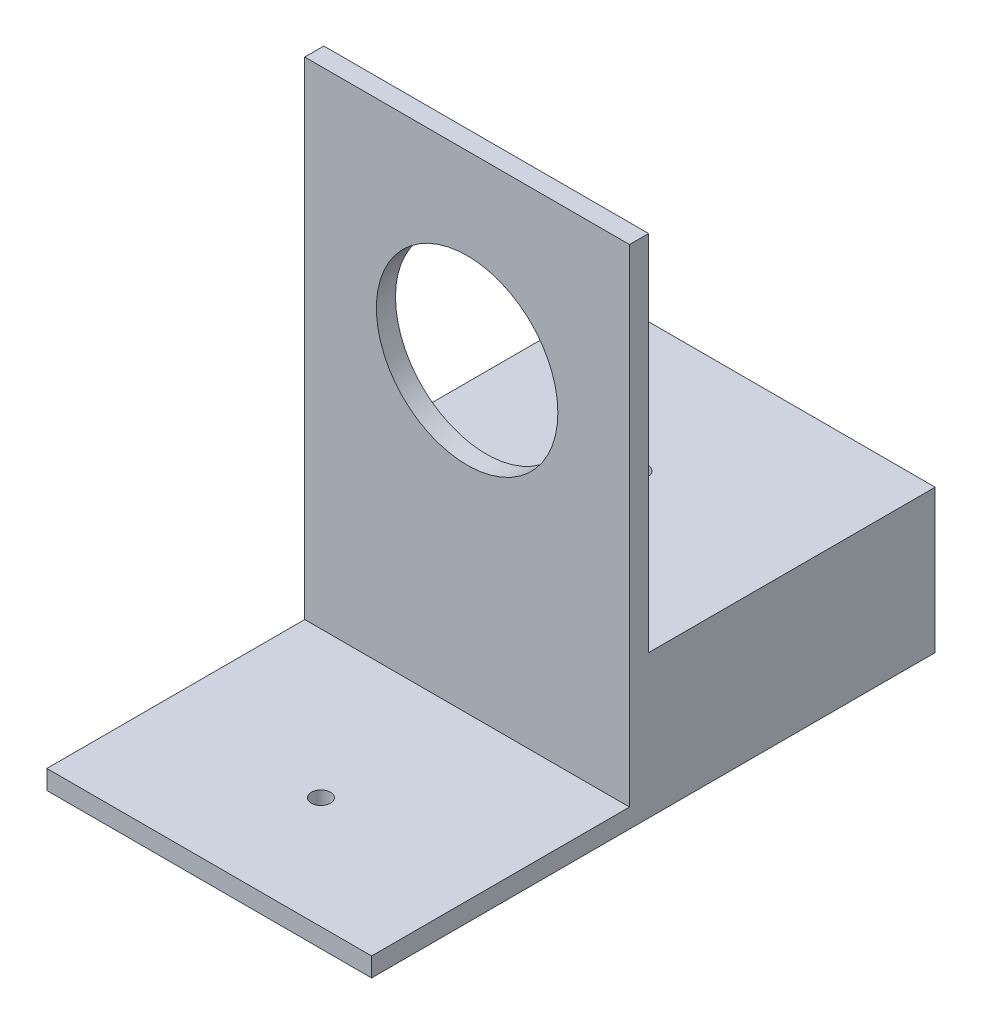
ISO-10303-21;
HEADER;
FILE_DESCRIPTION(('STEP AP214'),'2;1');
FILE_NAME('part.step','',(''),(''),'','','');
FILE_SCHEMA(('AUTOMOTIVE_DESIGN { 1 0 10303 214 1 1 1 1 }'));
ENDSEC;
DATA;
#1=APPLICATION_CONTEXT('core data for automotive mechanical design processes');
#2=APPLICATION_PROTOCOL_DEFINITION('international standard','automotive_design',2000,#1);
#3=PRODUCT_CONTEXT('',#1,'mechanical');
#4=PRODUCT('Part','Part','',(#3));
#5=PRODUCT_RELATED_PRODUCT_CATEGORY('part','',(#4));
#6=PRODUCT_DEFINITION_FORMATION('','',#4);
#7=PRODUCT_DEFINITION_CONTEXT('part definition',#1,'design');
#8=PRODUCT_DEFINITION('design','',#6,#7);
#9=PRODUCT_DEFINITION_SHAPE('','',#8);
#10=(LENGTH_UNIT() NAMED_UNIT(*) SI_UNIT(.MILLI.,.METRE.));
#11=(NAMED_UNIT(*) PLANE_ANGLE_UNIT() SI_UNIT($,.RADIAN.));
#12=(NAMED_UNIT(*) SI_UNIT($,.STERADIAN.) SOLID_ANGLE_UNIT());
#13=UNCERTAINTY_MEASURE_WITH_UNIT(LENGTH_MEASURE(1.E-05),#10,'distance_accuracy_value','');
#14=(GEOMETRIC_REPRESENTATION_CONTEXT(3) GLOBAL_UNCERTAINTY_ASSIGNED_CONTEXT((#13)) GLOBAL_UNIT_ASSIGNED_CONTEXT((#10,
#11,#12)) REPRESENTATION_CONTEXT('',''));
#15=CARTESIAN_POINT('',(0.,0.,0.));
#16=DIRECTION('',(0.,0.,1.));
#17=DIRECTION('',(1.,0.,0.));
#18=AXIS2_PLACEMENT_3D('',#15,#16,#17);
#19=CARTESIAN_POINT('',(0.,0.,2.));
#20=DIRECTION('',(0.,0.,-1.));
#21=DIRECTION('',(-1.,0.,0.));
#22=AXIS2_PLACEMENT_3D('',#19,#20,#21);
#23=PLANE('',#22);
#24=CARTESIAN_POINT('',(17.,34.,2.));
#25=DIRECTION('',(0.,0.,1.));
#26=DIRECTION('',(1.,0.,0.));
#27=AXIS2_PLACEMENT_3D('',#24,#25,#26);
#28=CIRCLE('',#27,9.5);
#29=CARTESIAN_POINT('',(26.5,34.,2.));
#30=VERTEX_POINT('',#29);
#31=EDGE_CURVE('E133',#30,#30,#28,.T.);
#32=ORIENTED_EDGE('',*,*,#31,.F.);
#33=EDGE_LOOP('',(#32));
#34=FACE_BOUND('',#33,.T.);
#35=DIRECTION('',(-1.,0.,0.));
#36=VECTOR('',#35,1.);
#37=CARTESIAN_POINT('',(0.,2.,2.));
#38=LINE('',#37,#36);
#39=CARTESIAN_POINT('',(34.,2.,2.));
#40=VERTEX_POINT('',#39);
#41=CARTESIAN_POINT('',(0.,2.,2.));
#42=VERTEX_POINT('',#41);
#43=EDGE_CURVE('E58',#40,#42,#38,.T.);
#44=ORIENTED_EDGE('',*,*,#43,.F.);
#45=DIRECTION('',(0.,1.,0.));
#46=VECTOR('',#45,1.);
#47=CARTESIAN_POINT('',(34.,0.,2.));
#48=LINE('',#47,#46);
#49=CARTESIAN_POINT('',(34.,53.,2.));
#50=VERTEX_POINT('',#49);
#51=EDGE_CURVE('E177',#40,#50,#48,.T.);
#52=ORIENTED_EDGE('',*,*,#51,.T.);
#53=DIRECTION('',(-1.,0.,0.));
#54=VECTOR('',#53,1.);
#55=CARTESIAN_POINT('',(0.,53.,2.));
#56=LINE('',#55,#54);
#57=CARTESIAN_POINT('',(0.,53.,2.));
#58=VERTEX_POINT('',#57);
#59=EDGE_CURVE('E171',#50,#58,#56,.T.);
#60=ORIENTED_EDGE('',*,*,#59,.T.);
#61=DIRECTION('',(0.,-1.,0.));
#62=VECTOR('',#61,1.);
#63=CARTESIAN_POINT('',(0.,0.,2.));
#64=LINE('',#63,#62);
#65=EDGE_CURVE('E167',#58,#42,#64,.T.);
#66=ORIENTED_EDGE('',*,*,#65,.T.);
#67=EDGE_LOOP('',(#44,#52,#60,#66));
#68=FACE_BOUND('',#67,.T.);
#69=ADVANCED_FACE('F33',(#34,#68),#23,.F.);
#70=CARTESIAN_POINT('',(0.,0.,2.));
#71=DIRECTION('',(1.,0.,0.));
#72=DIRECTION('',(0.,0.,-1.));
#73=AXIS2_PLACEMENT_3D('',#70,#71,#72);
#74=PLANE('',#73);
#75=DIRECTION('',(0.,-1.,0.));
#76=VECTOR('',#75,1.);
#77=CARTESIAN_POINT('',(0.,0.,0.));
#78=LINE('',#77,#76);
#79=CARTESIAN_POINT('',(0.,53.,0.));
#80=VERTEX_POINT('',#79);
#81=CARTESIAN_POINT('',(0.,15.,0.));
#82=VERTEX_POINT('',#81);
#83=EDGE_CURVE('E121',#80,#82,#78,.T.);
#84=ORIENTED_EDGE('',*,*,#83,.T.);
#85=DIRECTION('',(0.,0.,1.));
#86=VECTOR('',#85,1.);
#87=CARTESIAN_POINT('',(0.,15.,-30.));
#88=LINE('',#87,#86);
#89=CARTESIAN_POINT('',(0.,15.,-30.));
#90=VERTEX_POINT('',#89);
#91=EDGE_CURVE('E104',#90,#82,#88,.T.);
#92=ORIENTED_EDGE('',*,*,#91,.F.);
#93=DIRECTION('',(0.,1.,0.));
#94=VECTOR('',#93,1.);
#95=CARTESIAN_POINT('',(0.,0.,-30.));
#96=LINE('',#95,#94);
#97=CARTESIAN_POINT('',(0.,0.,-30.));
#98=VERTEX_POINT('',#97);
#99=EDGE_CURVE('E111',#98,#90,#96,.T.);
#100=ORIENTED_EDGE('',*,*,#99,.F.);
#101=DIRECTION('',(0.,0.,-1.));
#102=VECTOR('',#101,1.);
#103=CARTESIAN_POINT('',(0.,0.,2.));
#104=LINE('',#103,#102);
#105=CARTESIAN_POINT('',(0.,0.,29.));
#106=VERTEX_POINT('',#105);
#107=EDGE_CURVE('E11',#106,#98,#104,.T.);
#108=ORIENTED_EDGE('',*,*,#107,.F.);
#109=DIRECTION('',(0.,-1.,0.));
#110=VECTOR('',#109,1.);
#111=CARTESIAN_POINT('',(0.,0.,29.));
#112=LINE('',#111,#110);
#113=CARTESIAN_POINT('',(0.,2.,29.));
#114=VERTEX_POINT('',#113);
#115=EDGE_CURVE('E123',#114,#106,#112,.T.);
#116=ORIENTED_EDGE('',*,*,#115,.F.);
#117=DIRECTION('',(0.,0.,-1.));
#118=VECTOR('',#117,1.);
#119=CARTESIAN_POINT('',(0.,2.,29.));
#120=LINE('',#119,#118);
#121=EDGE_CURVE('E198',#114,#42,#120,.T.);
#122=ORIENTED_EDGE('',*,*,#121,.T.);
#123=ORIENTED_EDGE('',*,*,#65,.F.);
#124=DIRECTION('',(0.,0.,-1.));
#125=VECTOR('',#124,1.);
#126=CARTESIAN_POINT('',(0.,53.,2.));
#127=LINE('',#126,#125);
#128=EDGE_CURVE('E168',#58,#80,#127,.T.);
#129=ORIENTED_EDGE('',*,*,#128,.T.);
#130=EDGE_LOOP('',(#84,#92,#100,#108,#116,#122,#123,#129));
#131=FACE_BOUND('',#130,.T.);
#132=ADVANCED_FACE('F35',(#131),#74,.F.);
#133=CARTESIAN_POINT('',(0.,0.,2.));
#134=DIRECTION('',(0.,1.,0.));
#135=DIRECTION('',(0.,0.,1.));
#136=AXIS2_PLACEMENT_3D('',#133,#134,#135);
#137=PLANE('',#136);
#138=CARTESIAN_POINT('',(17.,0.,17.3047537644477));
#139=DIRECTION('',(0.,-1.,0.));
#140=DIRECTION('',(0.,0.,-1.));
#141=AXIS2_PLACEMENT_3D('',#138,#139,#140);
#142=CIRCLE('',#141,1.000000032);
#143=CARTESIAN_POINT('',(17.,0.,16.3047537324477));
#144=VERTEX_POINT('',#143);
#145=EDGE_CURVE('E146',#144,#144,#142,.T.);
#146=ORIENTED_EDGE('',*,*,#145,.F.);
#147=EDGE_LOOP('',(#146));
#148=FACE_BOUND('',#147,.T.);
#149=CARTESIAN_POINT('',(17.,0.,-15.9455875156916));
#150=DIRECTION('',(0.,-1.,0.));
#151=DIRECTION('',(0.,0.,-1.));
#152=AXIS2_PLACEMENT_3D('',#149,#150,#151);
#153=CIRCLE('',#152,1.000000032);
#154=CARTESIAN_POINT('',(17.,0.,-16.9455875476916));
#155=VERTEX_POINT('',#154);
#156=EDGE_CURVE('E136',#155,#155,#153,.T.);
#157=ORIENTED_EDGE('',*,*,#156,.F.);
#158=EDGE_LOOP('',(#157));
#159=FACE_BOUND('',#158,.T.);
#160=ORIENTED_EDGE('',*,*,#107,.T.);
#161=DIRECTION('',(-1.,0.,0.));
#162=VECTOR('',#161,1.);
#163=CARTESIAN_POINT('',(0.,0.,-30.));
#164=LINE('',#163,#162);
#165=CARTESIAN_POINT('',(34.,0.,-30.));
#166=VERTEX_POINT('',#165);
#167=EDGE_CURVE('E117',#166,#98,#164,.T.);
#168=ORIENTED_EDGE('',*,*,#167,.F.);
#169=DIRECTION('',(0.,0.,-1.));
#170=VECTOR('',#169,1.);
#171=CARTESIAN_POINT('',(34.,0.,2.));
#172=LINE('',#171,#170);
#173=CARTESIAN_POINT('',(34.,0.,29.));
#174=VERTEX_POINT('',#173);
#175=EDGE_CURVE('E42',#174,#166,#172,.T.);
#176=ORIENTED_EDGE('',*,*,#175,.F.);
#177=DIRECTION('',(1.,0.,0.));
#178=VECTOR('',#177,1.);
#179=CARTESIAN_POINT('',(0.,0.,29.));
#180=LINE('',#179,#178);
#181=EDGE_CURVE('E213',#106,#174,#180,.T.);
#182=ORIENTED_EDGE('',*,*,#181,.F.);
#183=EDGE_LOOP('',(#160,#168,#176,#182));
#184=FACE_BOUND('',#183,.T.);
#185=ADVANCED_FACE('F219',(#148,#159,#184),#137,.F.);
#186=CARTESIAN_POINT('',(34.,0.,2.));
#187=DIRECTION('',(-1.,0.,0.));
#188=DIRECTION('',(0.,0.,1.));
#189=AXIS2_PLACEMENT_3D('',#186,#187,#188);
#190=PLANE('',#189);
#191=ORIENTED_EDGE('',*,*,#175,.T.);
#192=DIRECTION('',(0.,-1.,0.));
#193=VECTOR('',#192,1.);
#194=CARTESIAN_POINT('',(34.,0.,-30.));
#195=LINE('',#194,#193);
#196=CARTESIAN_POINT('',(34.,15.,-30.));
#197=VERTEX_POINT('',#196);
#198=EDGE_CURVE('E110',#197,#166,#195,.T.);
#199=ORIENTED_EDGE('',*,*,#198,.F.);
#200=DIRECTION('',(0.,0.,1.));
#201=VECTOR('',#200,1.);
#202=CARTESIAN_POINT('',(34.,15.,-30.));
#203=LINE('',#202,#201);
#204=CARTESIAN_POINT('',(34.,15.,0.));
#205=VERTEX_POINT('',#204);
#206=EDGE_CURVE('E106',#197,#205,#203,.T.);
#207=ORIENTED_EDGE('',*,*,#206,.T.);
#208=DIRECTION('',(0.,1.,0.));
#209=VECTOR('',#208,1.);
#210=CARTESIAN_POINT('',(34.,0.,0.));
#211=LINE('',#210,#209);
#212=CARTESIAN_POINT('',(34.,53.,0.));
#213=VERTEX_POINT('',#212);
#214=EDGE_CURVE('E156',#205,#213,#211,.T.);
#215=ORIENTED_EDGE('',*,*,#214,.T.);
#216=DIRECTION('',(0.,0.,-1.));
#217=VECTOR('',#216,1.);
#218=CARTESIAN_POINT('',(34.,53.,2.));
#219=LINE('',#218,#217);
#220=EDGE_CURVE('E170',#50,#213,#219,.T.);
#221=ORIENTED_EDGE('',*,*,#220,.F.);
#222=ORIENTED_EDGE('',*,*,#51,.F.);
#223=DIRECTION('',(0.,0.,-1.));
#224=VECTOR('',#223,1.);
#225=CARTESIAN_POINT('',(34.,2.,29.));
#226=LINE('',#225,#224);
#227=CARTESIAN_POINT('',(34.,2.,29.));
#228=VERTEX_POINT('',#227);
#229=EDGE_CURVE('E202',#228,#40,#226,.T.);
#230=ORIENTED_EDGE('',*,*,#229,.F.);
#231=DIRECTION('',(0.,1.,0.));
#232=VECTOR('',#231,1.);
#233=CARTESIAN_POINT('',(34.,0.,29.));
#234=LINE('',#233,#232);
#235=EDGE_CURVE('E210',#174,#228,#234,.T.);
#236=ORIENTED_EDGE('',*,*,#235,.F.);
#237=EDGE_LOOP('',(#191,#199,#207,#215,#221,#222,#230,#236));
#238=FACE_BOUND('',#237,.T.);
#239=ADVANCED_FACE('F190',(#238),#190,.F.);
#240=CARTESIAN_POINT('',(0.,53.,2.));
#241=DIRECTION('',(0.,-1.,0.));
#242=DIRECTION('',(0.,0.,-1.));
#243=AXIS2_PLACEMENT_3D('',#240,#241,#242);
#244=PLANE('',#243);
#245=DIRECTION('',(-1.,0.,0.));
#246=VECTOR('',#245,1.);
#247=CARTESIAN_POINT('',(0.,53.,0.));
#248=LINE('',#247,#246);
#249=EDGE_CURVE('E159',#213,#80,#248,.T.);
#250=ORIENTED_EDGE('',*,*,#249,.T.);
#251=ORIENTED_EDGE('',*,*,#128,.F.);
#252=ORIENTED_EDGE('',*,*,#59,.F.);
#253=ORIENTED_EDGE('',*,*,#220,.T.);
#254=EDGE_LOOP('',(#250,#251,#252,#253));
#255=FACE_BOUND('',#254,.T.);
#256=ADVANCED_FACE('F193',(#255),#244,.F.);
#257=CARTESIAN_POINT('',(0.,0.,0.));
#258=DIRECTION('',(0.,0.,-1.));
#259=DIRECTION('',(-1.,0.,0.));
#260=AXIS2_PLACEMENT_3D('',#257,#258,#259);
#261=PLANE('',#260);
#262=CARTESIAN_POINT('',(17.,34.,0.));
#263=DIRECTION('',(0.,0.,-1.));
#264=DIRECTION('',(-1.,0.,0.));
#265=AXIS2_PLACEMENT_3D('',#262,#263,#264);
#266=CIRCLE('',#265,9.5);
#267=CARTESIAN_POINT('',(7.5,34.,0.));
#268=VERTEX_POINT('',#267);
#269=EDGE_CURVE('E131',#268,#268,#266,.T.);
#270=ORIENTED_EDGE('',*,*,#269,.F.);
#271=EDGE_LOOP('',(#270));
#272=FACE_BOUND('',#271,.T.);
#273=DIRECTION('',(1.,0.,0.));
#274=VECTOR('',#273,1.);
#275=CARTESIAN_POINT('',(0.,15.,0.));
#276=LINE('',#275,#274);
#277=EDGE_CURVE('E50',#82,#205,#276,.T.);
#278=ORIENTED_EDGE('',*,*,#277,.F.);
#279=ORIENTED_EDGE('',*,*,#83,.F.);
#280=ORIENTED_EDGE('',*,*,#249,.F.);
#281=ORIENTED_EDGE('',*,*,#214,.F.);
#282=EDGE_LOOP('',(#278,#279,#280,#281));
#283=FACE_BOUND('',#282,.T.);
#284=ADVANCED_FACE('F240',(#272,#283),#261,.T.);
#285=CARTESIAN_POINT('',(0.,2.,29.));
#286=DIRECTION('',(0.,-1.,0.));
#287=DIRECTION('',(0.,0.,-1.));
#288=AXIS2_PLACEMENT_3D('',#285,#286,#287);
#289=PLANE('',#288);
#290=CARTESIAN_POINT('',(17.,2.,17.3047537644477));
#291=DIRECTION('',(0.,-1.,0.));
#292=DIRECTION('',(0.,0.,-1.));
#293=AXIS2_PLACEMENT_3D('',#290,#291,#292);
#294=CIRCLE('',#293,1.000000032);
#295=CARTESIAN_POINT('',(17.,2.,16.3047537324477));
#296=VERTEX_POINT('',#295);
#297=EDGE_CURVE('E37',#296,#296,#294,.T.);
#298=ORIENTED_EDGE('',*,*,#297,.T.);
#299=EDGE_LOOP('',(#298));
#300=FACE_BOUND('',#299,.T.);
#301=ORIENTED_EDGE('',*,*,#43,.T.);
#302=ORIENTED_EDGE('',*,*,#121,.F.);
#303=DIRECTION('',(-1.,0.,0.));
#304=VECTOR('',#303,1.);
#305=CARTESIAN_POINT('',(0.,2.,29.));
#306=LINE('',#305,#304);
#307=EDGE_CURVE('E203',#228,#114,#306,.T.);
#308=ORIENTED_EDGE('',*,*,#307,.F.);
#309=ORIENTED_EDGE('',*,*,#229,.T.);
#310=EDGE_LOOP('',(#301,#302,#308,#309));
#311=FACE_BOUND('',#310,.T.);
#312=ADVANCED_FACE('F200',(#300,#311),#289,.F.);
#313=CARTESIAN_POINT('',(0.,0.,29.));
#314=DIRECTION('',(0.,0.,-1.));
#315=DIRECTION('',(-1.,0.,0.));
#316=AXIS2_PLACEMENT_3D('',#313,#314,#315);
#317=PLANE('',#316);
#318=ORIENTED_EDGE('',*,*,#115,.T.);
#319=ORIENTED_EDGE('',*,*,#181,.T.);
#320=ORIENTED_EDGE('',*,*,#235,.T.);
#321=ORIENTED_EDGE('',*,*,#307,.T.);
#322=EDGE_LOOP('',(#318,#319,#320,#321));
#323=FACE_BOUND('',#322,.T.);
#324=ADVANCED_FACE('F217',(#323),#317,.F.);
#325=CARTESIAN_POINT('',(0.,15.,-30.));
#326=DIRECTION('',(0.,-1.,0.));
#327=DIRECTION('',(1.,0.,0.));
#328=AXIS2_PLACEMENT_3D('',#325,#326,#327);
#329=PLANE('',#328);
#330=CARTESIAN_POINT('',(17.,15.,-15.9455875156916));
#331=DIRECTION('',(0.,-1.,0.));
#332=DIRECTION('',(1.,0.,0.));
#333=AXIS2_PLACEMENT_3D('',#330,#331,#332);
#334=CIRCLE('',#333,1.000000032);
#335=CARTESIAN_POINT('',(18.000000032,15.,-15.9455875156916));
#336=VERTEX_POINT('',#335);
#337=EDGE_CURVE('E134',#336,#336,#334,.T.);
#338=ORIENTED_EDGE('',*,*,#337,.T.);
#339=EDGE_LOOP('',(#338));
#340=FACE_BOUND('',#339,.T.);
#341=ORIENTED_EDGE('',*,*,#277,.T.);
#342=ORIENTED_EDGE('',*,*,#206,.F.);
#343=DIRECTION('',(1.,0.,0.));
#344=VECTOR('',#343,1.);
#345=CARTESIAN_POINT('',(0.,15.,-30.));
#346=LINE('',#345,#344);
#347=EDGE_CURVE('E100',#90,#197,#346,.T.);
#348=ORIENTED_EDGE('',*,*,#347,.F.);
#349=ORIENTED_EDGE('',*,*,#91,.T.);
#350=EDGE_LOOP('',(#341,#342,#348,#349));
#351=FACE_BOUND('',#350,.T.);
#352=ADVANCED_FACE('F102',(#340,#351),#329,.F.);
#353=CARTESIAN_POINT('',(0.,0.,-30.));
#354=DIRECTION('',(0.,0.,-1.));
#355=DIRECTION('',(-1.,0.,0.));
#356=AXIS2_PLACEMENT_3D('',#353,#354,#355);
#357=PLANE('',#356);
#358=ORIENTED_EDGE('',*,*,#99,.T.);
#359=ORIENTED_EDGE('',*,*,#347,.T.);
#360=ORIENTED_EDGE('',*,*,#198,.T.);
#361=ORIENTED_EDGE('',*,*,#167,.T.);
#362=EDGE_LOOP('',(#358,#359,#360,#361));
#363=FACE_BOUND('',#362,.T.);
#364=ADVANCED_FACE('F115',(#363),#357,.T.);
#365=CARTESIAN_POINT('',(17.,34.,-30.000025));
#366=DIRECTION('',(0.,0.,1.));
#367=DIRECTION('',(1.,0.,0.));
#368=AXIS2_PLACEMENT_3D('',#365,#366,#367);
#369=CYLINDRICAL_SURFACE('',#368,9.5);
#370=ORIENTED_EDGE('',*,*,#269,.T.);
#371=EDGE_LOOP('',(#370));
#372=FACE_BOUND('',#371,.T.);
#373=ORIENTED_EDGE('',*,*,#31,.T.);
#374=EDGE_LOOP('',(#373));
#375=FACE_BOUND('',#374,.T.);
#376=ADVANCED_FACE('F284',(#372,#375),#369,.F.);
#377=CARTESIAN_POINT('',(17.,0.,-15.9455875156916));
#378=DIRECTION('',(0.,-1.,0.));
#379=DIRECTION('',(0.,0.,-1.));
#380=AXIS2_PLACEMENT_3D('',#377,#378,#379);
#381=CYLINDRICAL_SURFACE('',#380,1.000000032);
#382=ORIENTED_EDGE('',*,*,#156,.T.);
#383=EDGE_LOOP('',(#382));
#384=FACE_BOUND('',#383,.T.);
#385=ORIENTED_EDGE('',*,*,#337,.F.);
#386=EDGE_LOOP('',(#385));
#387=FACE_BOUND('',#386,.T.);
#388=ADVANCED_FACE('F289',(#384,#387),#381,.F.);
#389=CARTESIAN_POINT('',(17.,0.,17.3047537644477));
#390=DIRECTION('',(0.,-1.,0.));
#391=DIRECTION('',(0.,0.,-1.));
#392=AXIS2_PLACEMENT_3D('',#389,#390,#391);
#393=CYLINDRICAL_SURFACE('',#392,1.000000032);
#394=ORIENTED_EDGE('',*,*,#145,.T.);
#395=EDGE_LOOP('',(#394));
#396=FACE_BOUND('',#395,.T.);
#397=ORIENTED_EDGE('',*,*,#297,.F.);
#398=EDGE_LOOP('',(#397));
#399=FACE_BOUND('',#398,.T.);
#400=ADVANCED_FACE('F296',(#396,#399),#393,.F.);
#401=CLOSED_SHELL('',(#69,#132,#185,#239,#256,#284,#312,#324,#352,#364,#376,#388,#400));
#402=MANIFOLD_SOLID_BREP('B2',#401);
#403=ADVANCED_BREP_SHAPE_REPRESENTATION('',(#18,#402),#14);
#404=SHAPE_DEFINITION_REPRESENTATION(#9,#403);
ENDSEC;
END-ISO-10303-21;
